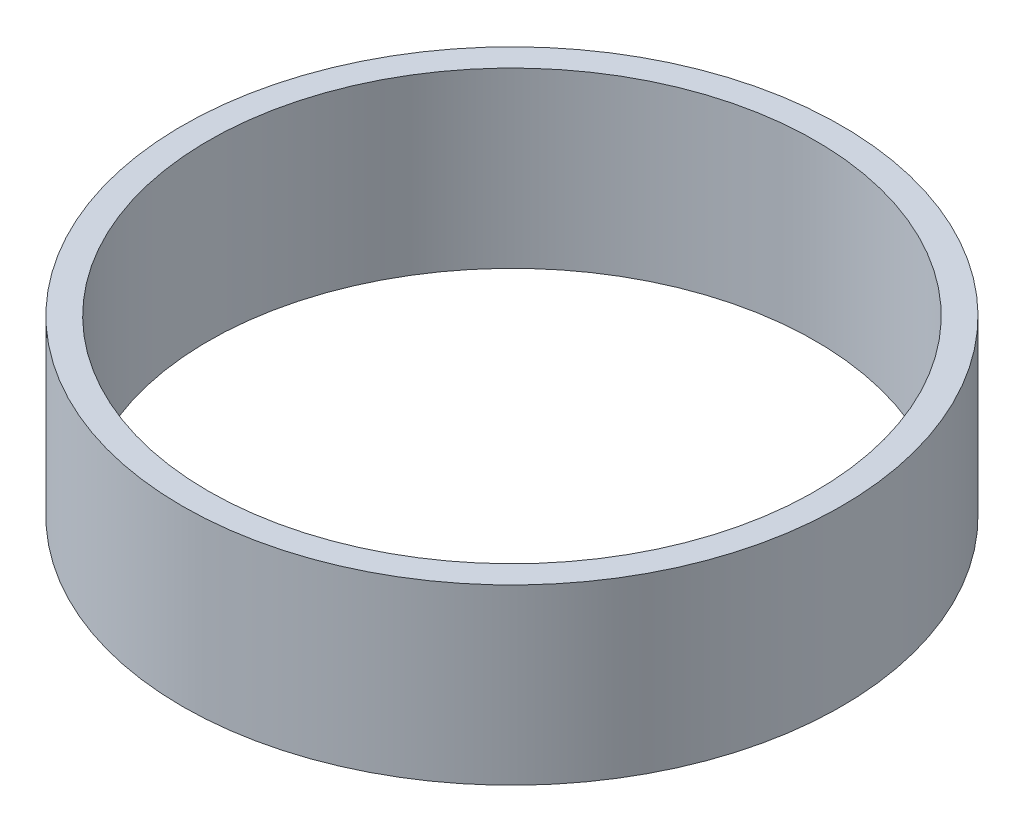
ISO-10303-21;
HEADER;
FILE_DESCRIPTION(('STEP AP214'),'2;1');
FILE_NAME('part.step','',(''),(''),'','','');
FILE_SCHEMA(('AUTOMOTIVE_DESIGN { 1 0 10303 214 1 1 1 1 }'));
ENDSEC;
DATA;
#1=APPLICATION_CONTEXT('core data for automotive mechanical design processes');
#2=APPLICATION_PROTOCOL_DEFINITION('international standard','automotive_design',2000,#1);
#3=PRODUCT_CONTEXT('',#1,'mechanical');
#4=PRODUCT('Part','Part','',(#3));
#5=PRODUCT_RELATED_PRODUCT_CATEGORY('part','',(#4));
#6=PRODUCT_DEFINITION_FORMATION('','',#4);
#7=PRODUCT_DEFINITION_CONTEXT('part definition',#1,'design');
#8=PRODUCT_DEFINITION('design','',#6,#7);
#9=PRODUCT_DEFINITION_SHAPE('','',#8);
#10=(LENGTH_UNIT() NAMED_UNIT(*) SI_UNIT(.MILLI.,.METRE.));
#11=(NAMED_UNIT(*) PLANE_ANGLE_UNIT() SI_UNIT($,.RADIAN.));
#12=(NAMED_UNIT(*) SI_UNIT($,.STERADIAN.) SOLID_ANGLE_UNIT());
#13=UNCERTAINTY_MEASURE_WITH_UNIT(LENGTH_MEASURE(1.E-05),#10,'distance_accuracy_value','');
#14=(GEOMETRIC_REPRESENTATION_CONTEXT(3) GLOBAL_UNCERTAINTY_ASSIGNED_CONTEXT((#13)) GLOBAL_UNIT_ASSIGNED_CONTEXT((#10,
#11,#12)) REPRESENTATION_CONTEXT('',''));
#15=CARTESIAN_POINT('',(0.,0.,0.));
#16=DIRECTION('',(0.,0.,1.));
#17=DIRECTION('',(1.,0.,0.));
#18=AXIS2_PLACEMENT_3D('',#15,#16,#17);
#19=CARTESIAN_POINT('',(0.,8.,0.));
#20=DIRECTION('',(0.,1.,0.));
#21=DIRECTION('',(0.,0.,1.));
#22=AXIS2_PLACEMENT_3D('',#19,#20,#21);
#23=PLANE('',#22);
#24=CARTESIAN_POINT('',(0.,8.,0.));
#25=DIRECTION('',(0.,1.,0.));
#26=DIRECTION('',(0.,0.,1.));
#27=AXIS2_PLACEMENT_3D('',#24,#25,#26);
#28=CIRCLE('',#27,15.2);
#29=CARTESIAN_POINT('',(0.,8.,15.2));
#30=VERTEX_POINT('',#29);
#31=EDGE_CURVE('E10',#30,#30,#28,.T.);
#32=ORIENTED_EDGE('',*,*,#31,.T.);
#33=EDGE_LOOP('',(#32));
#34=FACE_BOUND('',#33,.T.);
#35=CARTESIAN_POINT('',(0.,8.,0.));
#36=DIRECTION('',(0.,1.,0.));
#37=DIRECTION('',(0.,0.,1.));
#38=AXIS2_PLACEMENT_3D('',#35,#36,#37);
#39=CIRCLE('',#38,14.);
#40=CARTESIAN_POINT('',(0.,8.,14.));
#41=VERTEX_POINT('',#40);
#42=EDGE_CURVE('E48',#41,#41,#39,.T.);
#43=ORIENTED_EDGE('',*,*,#42,.F.);
#44=EDGE_LOOP('',(#43));
#45=FACE_BOUND('',#44,.T.);
#46=ADVANCED_FACE('F37',(#34,#45),#23,.T.);
#47=CARTESIAN_POINT('',(0.,0.,0.));
#48=DIRECTION('',(0.,1.,0.));
#49=DIRECTION('',(0.,0.,1.));
#50=AXIS2_PLACEMENT_3D('',#47,#48,#49);
#51=PLANE('',#50);
#52=CARTESIAN_POINT('',(0.,0.,0.));
#53=DIRECTION('',(0.,1.,0.));
#54=DIRECTION('',(0.,0.,1.));
#55=AXIS2_PLACEMENT_3D('',#52,#53,#54);
#56=CIRCLE('',#55,15.2);
#57=CARTESIAN_POINT('',(0.,0.,15.2));
#58=VERTEX_POINT('',#57);
#59=EDGE_CURVE('E41',#58,#58,#56,.T.);
#60=ORIENTED_EDGE('',*,*,#59,.F.);
#61=EDGE_LOOP('',(#60));
#62=FACE_BOUND('',#61,.T.);
#63=CARTESIAN_POINT('',(0.,0.,0.));
#64=DIRECTION('',(0.,1.,0.));
#65=DIRECTION('',(0.,0.,1.));
#66=AXIS2_PLACEMENT_3D('',#63,#64,#65);
#67=CIRCLE('',#66,14.);
#68=CARTESIAN_POINT('',(0.,0.,14.));
#69=VERTEX_POINT('',#68);
#70=EDGE_CURVE('E50',#69,#69,#67,.T.);
#71=ORIENTED_EDGE('',*,*,#70,.T.);
#72=EDGE_LOOP('',(#71));
#73=FACE_BOUND('',#72,.T.);
#74=ADVANCED_FACE('F60',(#62,#73),#51,.F.);
#75=CARTESIAN_POINT('',(0.,8.,0.));
#76=DIRECTION('',(0.,-1.,0.));
#77=DIRECTION('',(0.,0.,-1.));
#78=AXIS2_PLACEMENT_3D('',#75,#76,#77);
#79=CYLINDRICAL_SURFACE('',#78,15.2);
#80=ORIENTED_EDGE('',*,*,#31,.F.);
#81=EDGE_LOOP('',(#80));
#82=FACE_BOUND('',#81,.T.);
#83=ORIENTED_EDGE('',*,*,#59,.T.);
#84=EDGE_LOOP('',(#83));
#85=FACE_BOUND('',#84,.T.);
#86=ADVANCED_FACE('F39',(#82,#85),#79,.T.);
#87=CARTESIAN_POINT('',(0.,8.,0.));
#88=DIRECTION('',(0.,-1.,0.));
#89=DIRECTION('',(0.,0.,-1.));
#90=AXIS2_PLACEMENT_3D('',#87,#88,#89);
#91=CYLINDRICAL_SURFACE('',#90,14.);
#92=ORIENTED_EDGE('',*,*,#42,.T.);
#93=EDGE_LOOP('',(#92));
#94=FACE_BOUND('',#93,.T.);
#95=ORIENTED_EDGE('',*,*,#70,.F.);
#96=EDGE_LOOP('',(#95));
#97=FACE_BOUND('',#96,.T.);
#98=ADVANCED_FACE('F56',(#94,#97),#91,.F.);
#99=CLOSED_SHELL('',(#46,#74,#86,#98));
#100=MANIFOLD_SOLID_BREP('B2',#99);
#101=ADVANCED_BREP_SHAPE_REPRESENTATION('',(#18,#100),#14);
#102=SHAPE_DEFINITION_REPRESENTATION(#9,#101);
ENDSEC;
END-ISO-10303-21;
